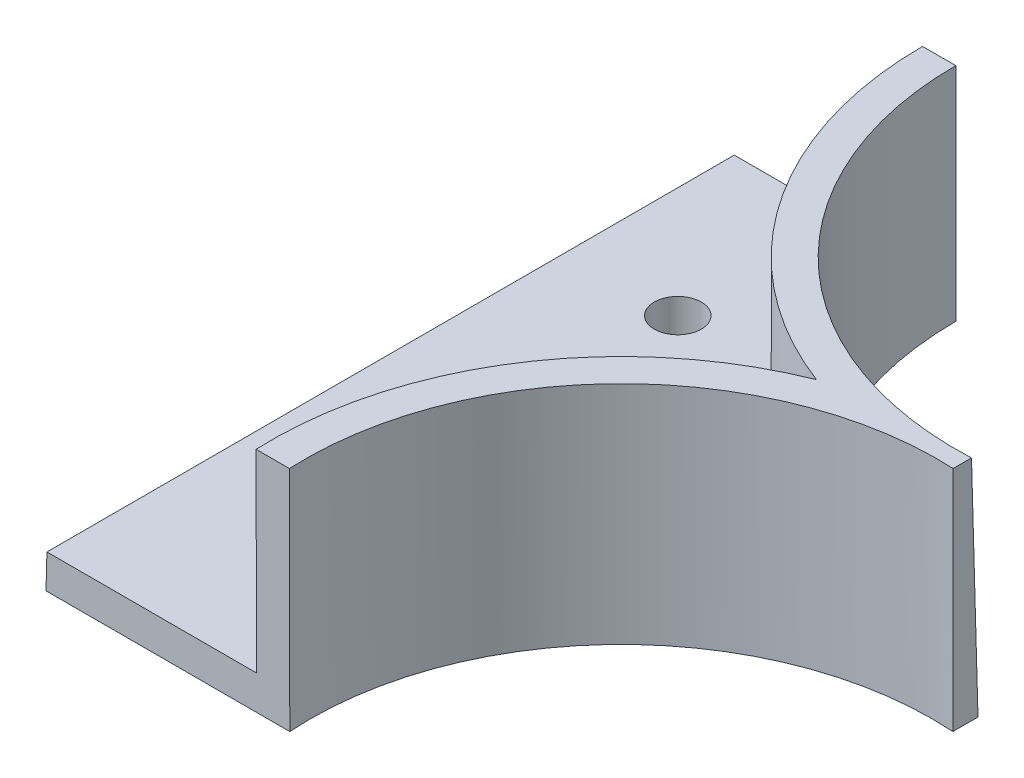
ISO-10303-21;
HEADER;
FILE_DESCRIPTION(('STEP AP214'),'2;1');
FILE_NAME('part.step','',(''),(''),'','','');
FILE_SCHEMA(('AUTOMOTIVE_DESIGN { 1 0 10303 214 1 1 1 1 }'));
ENDSEC;
DATA;
#1=APPLICATION_CONTEXT('core data for automotive mechanical design processes');
#2=APPLICATION_PROTOCOL_DEFINITION('international standard','automotive_design',2000,#1);
#3=PRODUCT_CONTEXT('',#1,'mechanical');
#4=PRODUCT('Part','Part','',(#3));
#5=PRODUCT_RELATED_PRODUCT_CATEGORY('part','',(#4));
#6=PRODUCT_DEFINITION_FORMATION('','',#4);
#7=PRODUCT_DEFINITION_CONTEXT('part definition',#1,'design');
#8=PRODUCT_DEFINITION('design','',#6,#7);
#9=PRODUCT_DEFINITION_SHAPE('','',#8);
#10=(LENGTH_UNIT() NAMED_UNIT(*) SI_UNIT(.MILLI.,.METRE.));
#11=(NAMED_UNIT(*) PLANE_ANGLE_UNIT() SI_UNIT($,.RADIAN.));
#12=(NAMED_UNIT(*) SI_UNIT($,.STERADIAN.) SOLID_ANGLE_UNIT());
#13=UNCERTAINTY_MEASURE_WITH_UNIT(LENGTH_MEASURE(1.E-05),#10,'distance_accuracy_value','');
#14=(GEOMETRIC_REPRESENTATION_CONTEXT(3) GLOBAL_UNCERTAINTY_ASSIGNED_CONTEXT((#13)) GLOBAL_UNIT_ASSIGNED_CONTEXT((#10,
#11,#12)) REPRESENTATION_CONTEXT('',''));
#15=CARTESIAN_POINT('',(0.,0.,0.));
#16=DIRECTION('',(0.,0.,1.));
#17=DIRECTION('',(1.,0.,0.));
#18=AXIS2_PLACEMENT_3D('',#15,#16,#17);
#19=CARTESIAN_POINT('',(0.,70.,30.1));
#20=DIRECTION('',(0.,0.027764619990052,0.999614488628895));
#21=DIRECTION('',(0.,-0.999614488628896,0.027764619990052));
#22=AXIS2_PLACEMENT_3D('',#19,#20,#21);
#23=PLANE('',#22);
#24=CARTESIAN_POINT('',(20.5510677321987,-51.0082949242049,33.4610450452984));
#25=CARTESIAN_POINT('',(20.2350674800329,-40.8551927948117,33.1790393065367));
#26=CARTESIAN_POINT('',(19.9241048759291,-30.7019348014339,32.8970292386016));
#27=CARTESIAN_POINT('',(19.3114474008707,-10.39514644559,32.3330015375908));
#28=CARTESIAN_POINT('',(19.0097525233991,-0.241616083320481,32.0509839045206));
#29=CARTESIAN_POINT('',(18.4148225292552,20.0656908120619,31.4869418009042));
#30=CARTESIAN_POINT('',(18.1215874116505,30.2194673451475,31.2049173303588));
#31=CARTESIAN_POINT('',(17.5429250394866,50.5272499485599,30.640862013796));
#32=CARTESIAN_POINT('',(17.2574977904158,60.681256019043,30.3588311677742));
#33=CARTESIAN_POINT('',(16.9756487494961,70.835360844513,30.0767975788003));
#34=B_SPLINE_CURVE_WITH_KNOTS('',3,(#24,#25,#26,#27,#28,#29,#30,#31,#32,#33),.UNSPECIFIED.,.F.,
.F.,(4,2,2,2,4),(0.,30.4857942211204,60.9715670039907,91.4573364265168,121.943127278152),.UNSPECIFIED.);
#35=CARTESIAN_POINT('',(18.9154450441281,3.,31.9609469555459));
#36=VERTEX_POINT('',#35);
#37=CARTESIAN_POINT('',(18.418129138932,20.,31.4887663847357));
#38=VERTEX_POINT('',#37);
#39=EDGE_CURVE('E213',#36,#38,#34,.T.);
#40=ORIENTED_EDGE('',*,*,#39,.F.);
#41=DIRECTION('',(-1.,0.,0.));
#42=VECTOR('',#41,1.);
#43=CARTESIAN_POINT('',(0.,3.,31.9609469555459));
#44=LINE('',#43,#42);
#45=CARTESIAN_POINT('',(0.,3.,31.9609469555459));
#46=VERTEX_POINT('',#45);
#47=EDGE_CURVE('E215',#36,#46,#44,.T.);
#48=ORIENTED_EDGE('',*,*,#47,.T.);
#49=DIRECTION('',(0.,-0.999614488628896,0.027764619990052));
#50=VECTOR('',#49,1.);
#51=CARTESIAN_POINT('',(0.,71.6707857680826,30.0535933777838));
#52=LINE('',#51,#50);
#53=CARTESIAN_POINT('',(0.,0.,32.04427293863));
#54=VERTEX_POINT('',#53);
#55=EDGE_CURVE('E156',#46,#54,#52,.T.);
#56=ORIENTED_EDGE('',*,*,#55,.T.);
#57=DIRECTION('',(-1.,0.,0.));
#58=VECTOR('',#57,1.);
#59=CARTESIAN_POINT('',(0.,0.,32.04427293863));
#60=LINE('',#59,#58);
#61=CARTESIAN_POINT('',(22.011723459952,0.,32.04427293863));
#62=VERTEX_POINT('',#61);
#63=EDGE_CURVE('E267',#62,#54,#60,.T.);
#64=ORIENTED_EDGE('',*,*,#63,.F.);
#65=CARTESIAN_POINT('',(22.011723459952,0.,32.04427293863));
#66=CARTESIAN_POINT('',(21.7410608127319,9.09174431583642,31.7917467609411));
#67=CARTESIAN_POINT('',(21.4742923334893,18.1836041859997,31.5392173736929));
#68=CARTESIAN_POINT('',(20.9479726645709,36.367529354211,31.0341528933697));
#69=CARTESIAN_POINT('',(20.6884214722099,45.4595946521814,30.7816178002968));
#70=CARTESIAN_POINT('',(20.3596352985134,57.1264461519254,30.4575671767258));
#71=CARTESIAN_POINT('',(20.2873437669017,59.7011465756542,30.386054028741));
#72=CARTESIAN_POINT('',(20.1432829093874,64.8505622927659,30.2430273197619));
#73=CARTESIAN_POINT('',(20.0715135835397,67.4252775861504,30.1715137587676));
#74=CARTESIAN_POINT('',(20.,70.,30.1));
#75=B_SPLINE_CURVE_WITH_KNOTS('',3,(#65,#66,#67,#68,#69,#70,#71,#72,#73,#74),.UNSPECIFIED.,.F.,
.F.,(4,2,2,2,4),(0.,27.2978299543117,54.5956497523319,62.3257727637899,70.0558965889786),.UNSPECIFIED.);
#76=CARTESIAN_POINT('',(21.4224910652476,20.,31.4887663847357));
#77=VERTEX_POINT('',#76);
#78=EDGE_CURVE('E180',#62,#77,#75,.T.);
#79=ORIENTED_EDGE('',*,*,#78,.T.);
#80=DIRECTION('',(-1.,0.,0.));
#81=VECTOR('',#80,1.);
#82=CARTESIAN_POINT('',(51.94427293863,20.,31.4887663847357));
#83=LINE('',#82,#81);
#84=EDGE_CURVE('E61',#77,#38,#83,.T.);
#85=ORIENTED_EDGE('',*,*,#84,.T.);
#86=EDGE_LOOP('',(#40,#48,#56,#64,#79,#85));
#87=FACE_BOUND('',#86,.T.);
#88=ADVANCED_FACE('F39',(#87),#23,.T.);
#89=CARTESIAN_POINT('',(0.,70.,-30.1));
#90=DIRECTION('',(1.,0.,0.));
#91=DIRECTION('',(0.,0.,-1.));
#92=AXIS2_PLACEMENT_3D('',#89,#90,#91);
#93=PLANE('',#92);
#94=DIRECTION('',(0.,0.,1.));
#95=VECTOR('',#94,1.);
#96=CARTESIAN_POINT('',(0.,3.,-30.1));
#97=LINE('',#96,#95);
#98=CARTESIAN_POINT('',(0.,3.,-30.1));
#99=VERTEX_POINT('',#98);
#100=EDGE_CURVE('E131',#99,#46,#97,.T.);
#101=ORIENTED_EDGE('',*,*,#100,.F.);
#102=DIRECTION('',(0.,-1.,0.));
#103=VECTOR('',#102,1.);
#104=CARTESIAN_POINT('',(0.,70.,-30.1));
#105=LINE('',#104,#103);
#106=CARTESIAN_POINT('',(0.,0.,-30.1));
#107=VERTEX_POINT('',#106);
#108=EDGE_CURVE('E48',#99,#107,#105,.T.);
#109=ORIENTED_EDGE('',*,*,#108,.T.);
#110=DIRECTION('',(0.,0.,1.));
#111=VECTOR('',#110,1.);
#112=CARTESIAN_POINT('',(0.,0.,-30.1));
#113=LINE('',#112,#111);
#114=EDGE_CURVE('E160',#107,#54,#113,.T.);
#115=ORIENTED_EDGE('',*,*,#114,.T.);
#116=ORIENTED_EDGE('',*,*,#55,.F.);
#117=EDGE_LOOP('',(#101,#109,#115,#116));
#118=FACE_BOUND('',#117,.T.);
#119=ADVANCED_FACE('F205',(#118),#93,.F.);
#120=CARTESIAN_POINT('',(50.,70.,-30.1));
#121=DIRECTION('',(0.999614488628895,0.027764619990052,0.));
#122=DIRECTION('',(-0.027764619990052,0.999614488628896,0.));
#123=AXIS2_PLACEMENT_3D('',#120,#121,#122);
#124=PLANE('',#123);
#125=CARTESIAN_POINT('',(50.,70.,-30.1));
#126=DIRECTION('',(0.999614488628895,0.027764619990052,0.));
#127=DIRECTION('',(-0.027764619990052,0.999614488628896,0.));
#128=AXIS2_PLACEMENT_3D('',#125,#126,#127);
#129=ELLIPSE('',#128,1080.51181722454,30.);
#130=CARTESIAN_POINT('',(51.94427293863,0.,-0.163069583871647));
#131=VERTEX_POINT('',#130);
#132=CARTESIAN_POINT('',(51.3887663847357,20.,-0.132161774184854));
#133=VERTEX_POINT('',#132);
#134=EDGE_CURVE('E159',#131,#133,#129,.F.);
#135=ORIENTED_EDGE('',*,*,#134,.T.);
#136=DIRECTION('',(0.,0.,-1.));
#137=VECTOR('',#136,1.);
#138=CARTESIAN_POINT('',(51.3887663847357,20.,-30.1));
#139=LINE('',#138,#137);
#140=CARTESIAN_POINT('',(51.3887663847357,20.,1.52249106524754));
#141=VERTEX_POINT('',#140);
#142=EDGE_CURVE('E141',#133,#141,#139,.F.);
#143=ORIENTED_EDGE('',*,*,#142,.T.);
#144=CARTESIAN_POINT('',(51.94427293863,0.,2.11172345995204));
#145=CARTESIAN_POINT('',(51.6917467609411,9.09174431583642,1.84106081273193));
#146=CARTESIAN_POINT('',(51.4392173736929,18.1836041859997,1.57429233348931));
#147=CARTESIAN_POINT('',(50.9341528933697,36.367529354211,1.04797266457088));
#148=CARTESIAN_POINT('',(50.6816178002968,45.4595946521814,0.788421472209872));
#149=CARTESIAN_POINT('',(50.3575671767258,57.1264461519254,0.459635298513346));
#150=CARTESIAN_POINT('',(50.286054028741,59.7011465756542,0.387343766901686));
#151=CARTESIAN_POINT('',(50.143027319762,64.8505622927659,0.243282909387387));
#152=CARTESIAN_POINT('',(50.0715137587676,67.4252775861504,0.171513583539721));
#153=CARTESIAN_POINT('',(50.,70.,0.100000000000001));
#154=B_SPLINE_CURVE_WITH_KNOTS('',3,(#144,#145,#146,#147,#148,#149,#150,#151,#152,#153),
.UNSPECIFIED.,.F.,.F.,(4,2,2,2,4),(0.,27.2978299543117,54.5956497523319,62.3257727637899,
70.0558965889786),.UNSPECIFIED.);
#155=CARTESIAN_POINT('',(51.94427293863,0.,2.11172345995204));
#156=VERTEX_POINT('',#155);
#157=EDGE_CURVE('E171',#156,#141,#154,.T.);
#158=ORIENTED_EDGE('',*,*,#157,.F.);
#159=DIRECTION('',(0.,0.,1.));
#160=VECTOR('',#159,1.);
#161=CARTESIAN_POINT('',(51.94427293863,0.,-30.1));
#162=LINE('',#161,#160);
#163=EDGE_CURVE('E164',#156,#131,#162,.F.);
#164=ORIENTED_EDGE('',*,*,#163,.T.);
#165=EDGE_LOOP('',(#135,#143,#158,#164));
#166=FACE_BOUND('',#165,.T.);
#167=ADVANCED_FACE('F186',(#166),#124,.T.);
#168=CARTESIAN_POINT('',(0.,70.,-30.1));
#169=DIRECTION('',(0.,0.,1.));
#170=DIRECTION('',(1.,0.,0.));
#171=AXIS2_PLACEMENT_3D('',#168,#169,#170);
#172=PLANE('',#171);
#173=DIRECTION('',(-1.,0.,0.));
#174=VECTOR('',#173,1.);
#175=CARTESIAN_POINT('',(0.,3.,-30.1));
#176=LINE('',#175,#174);
#177=CARTESIAN_POINT('',(17.,3.,-30.1));
#178=VERTEX_POINT('',#177);
#179=EDGE_CURVE('E129',#178,#99,#176,.T.);
#180=ORIENTED_EDGE('',*,*,#179,.F.);
#181=DIRECTION('',(0.,1.,0.));
#182=VECTOR('',#181,1.);
#183=CARTESIAN_POINT('',(17.,3.,-30.1));
#184=LINE('',#183,#182);
#185=CARTESIAN_POINT('',(17.,20.,-30.1));
#186=VERTEX_POINT('',#185);
#187=EDGE_CURVE('E114',#178,#186,#184,.T.);
#188=ORIENTED_EDGE('',*,*,#187,.T.);
#189=DIRECTION('',(-1.,0.,0.));
#190=VECTOR('',#189,1.);
#191=CARTESIAN_POINT('',(51.94427293863,20.,-30.1));
#192=LINE('',#191,#190);
#193=CARTESIAN_POINT('',(20.,20.,-30.1));
#194=VERTEX_POINT('',#193);
#195=EDGE_CURVE('E126',#194,#186,#192,.T.);
#196=ORIENTED_EDGE('',*,*,#195,.F.);
#197=DIRECTION('',(0.,1.,0.));
#198=VECTOR('',#197,1.);
#199=CARTESIAN_POINT('',(20.,0.,-30.1));
#200=LINE('',#199,#198);
#201=CARTESIAN_POINT('',(20.,0.,-30.1));
#202=VERTEX_POINT('',#201);
#203=EDGE_CURVE('E155',#202,#194,#200,.T.);
#204=ORIENTED_EDGE('',*,*,#203,.F.);
#205=DIRECTION('',(-1.,0.,0.));
#206=VECTOR('',#205,1.);
#207=CARTESIAN_POINT('',(0.,0.,-30.1));
#208=LINE('',#207,#206);
#209=EDGE_CURVE('E165',#202,#107,#208,.T.);
#210=ORIENTED_EDGE('',*,*,#209,.T.);
#211=ORIENTED_EDGE('',*,*,#108,.F.);
#212=EDGE_LOOP('',(#180,#188,#196,#204,#210,#211));
#213=FACE_BOUND('',#212,.T.);
#214=ADVANCED_FACE('F124',(#213),#172,.F.);
#215=CARTESIAN_POINT('',(0.,0.,0.));
#216=DIRECTION('',(0.,1.,0.));
#217=DIRECTION('',(0.,0.,1.));
#218=AXIS2_PLACEMENT_3D('',#215,#216,#217);
#219=PLANE('',#218);
#220=CARTESIAN_POINT('',(10.,0.,-15.));
#221=DIRECTION('',(0.,1.,0.));
#222=DIRECTION('',(0.,0.,1.));
#223=AXIS2_PLACEMENT_3D('',#220,#221,#222);
#224=CIRCLE('',#223,2.125);
#225=CARTESIAN_POINT('',(10.,0.,-12.875));
#226=VERTEX_POINT('',#225);
#227=EDGE_CURVE('E120',#226,#226,#224,.T.);
#228=ORIENTED_EDGE('',*,*,#227,.T.);
#229=EDGE_LOOP('',(#228));
#230=FACE_BOUND('',#229,.T.);
#231=CARTESIAN_POINT('',(10.,0.,15.));
#232=DIRECTION('',(0.,1.,0.));
#233=DIRECTION('',(0.,0.,-1.));
#234=AXIS2_PLACEMENT_3D('',#231,#232,#233);
#235=CIRCLE('',#234,2.125);
#236=CARTESIAN_POINT('',(10.,0.,12.875));
#237=VERTEX_POINT('',#236);
#238=EDGE_CURVE('E290',#237,#237,#235,.T.);
#239=ORIENTED_EDGE('',*,*,#238,.T.);
#240=EDGE_LOOP('',(#239));
#241=FACE_BOUND('',#240,.T.);
#242=CARTESIAN_POINT('',(50.,0.,30.1));
#243=DIRECTION('',(0.,1.,0.));
#244=DIRECTION('',(0.,0.,1.));
#245=AXIS2_PLACEMENT_3D('',#242,#243,#244);
#246=CIRCLE('',#245,28.05572706137);
#247=EDGE_CURVE('E150',#62,#156,#246,.F.);
#248=ORIENTED_EDGE('',*,*,#247,.F.);
#249=ORIENTED_EDGE('',*,*,#63,.T.);
#250=ORIENTED_EDGE('',*,*,#114,.F.);
#251=ORIENTED_EDGE('',*,*,#209,.F.);
#252=CARTESIAN_POINT('',(50.,0.,-30.1));
#253=DIRECTION('',(0.,1.,0.));
#254=DIRECTION('',(0.,0.,-1.));
#255=AXIS2_PLACEMENT_3D('',#252,#253,#254);
#256=CIRCLE('',#255,30.);
#257=EDGE_CURVE('E151',#202,#131,#256,.T.);
#258=ORIENTED_EDGE('',*,*,#257,.T.);
#259=ORIENTED_EDGE('',*,*,#163,.F.);
#260=EDGE_LOOP('',(#248,#249,#250,#251,#258,#259));
#261=FACE_BOUND('',#260,.T.);
#262=ADVANCED_FACE('F201',(#230,#241,#261),#219,.F.);
#263=CARTESIAN_POINT('',(50.,0.,-30.1));
#264=DIRECTION('',(0.,1.,0.));
#265=DIRECTION('',(0.,0.,1.));
#266=AXIS2_PLACEMENT_3D('',#263,#264,#265);
#267=CYLINDRICAL_SURFACE('',#266,30.);
#268=ORIENTED_EDGE('',*,*,#203,.T.);
#269=CARTESIAN_POINT('',(50.,20.,-30.1));
#270=DIRECTION('',(0.,-1.,0.));
#271=DIRECTION('',(0.,0.,-1.));
#272=AXIS2_PLACEMENT_3D('',#269,#270,#271);
#273=CIRCLE('',#272,30.);
#274=EDGE_CURVE('E136',#194,#133,#273,.F.);
#275=ORIENTED_EDGE('',*,*,#274,.T.);
#276=ORIENTED_EDGE('',*,*,#134,.F.);
#277=ORIENTED_EDGE('',*,*,#257,.F.);
#278=EDGE_LOOP('',(#268,#275,#276,#277));
#279=FACE_BOUND('',#278,.T.);
#280=ADVANCED_FACE('F192',(#279),#267,.F.);
#281=CARTESIAN_POINT('',(50.,70.,30.1));
#282=DIRECTION('',(0.,1.,0.));
#283=DIRECTION('',(0.,0.,1.));
#284=AXIS2_PLACEMENT_3D('',#281,#282,#283);
#285=CONICAL_SURFACE('',#284,30.,0.0277681883992298);
#286=CARTESIAN_POINT('',(50.,20.,30.1));
#287=DIRECTION('',(0.,-1.,0.));
#288=DIRECTION('',(0.,0.,-1.));
#289=AXIS2_PLACEMENT_3D('',#286,#287,#288);
#290=CIRCLE('',#289,28.6112336152643);
#291=EDGE_CURVE('E11',#77,#141,#290,.T.);
#292=ORIENTED_EDGE('',*,*,#291,.F.);
#293=ORIENTED_EDGE('',*,*,#78,.F.);
#294=ORIENTED_EDGE('',*,*,#247,.T.);
#295=ORIENTED_EDGE('',*,*,#157,.T.);
#296=EDGE_LOOP('',(#292,#293,#294,#295));
#297=FACE_BOUND('',#296,.T.);
#298=ADVANCED_FACE('F189',(#297),#285,.F.);
#299=CARTESIAN_POINT('',(51.94427293863,20.,-30.1));
#300=DIRECTION('',(0.,-1.,0.));
#301=DIRECTION('',(0.,0.,-1.));
#302=AXIS2_PLACEMENT_3D('',#299,#300,#301);
#303=PLANE('',#302);
#304=CARTESIAN_POINT('',(50.,20.,30.1));
#305=DIRECTION('',(0.,-1.,0.));
#306=DIRECTION('',(0.,0.,-1.));
#307=AXIS2_PLACEMENT_3D('',#304,#305,#306);
#308=CIRCLE('',#307,31.6123905954066);
#309=CARTESIAN_POINT('',(38.2693945248915,20.,0.744657482088448));
#310=VERTEX_POINT('',#309);
#311=EDGE_CURVE('E55',#38,#310,#308,.T.);
#312=ORIENTED_EDGE('',*,*,#311,.F.);
#313=ORIENTED_EDGE('',*,*,#84,.F.);
#314=ORIENTED_EDGE('',*,*,#291,.T.);
#315=ORIENTED_EDGE('',*,*,#142,.F.);
#316=ORIENTED_EDGE('',*,*,#274,.F.);
#317=ORIENTED_EDGE('',*,*,#195,.T.);
#318=CARTESIAN_POINT('',(50.,20.,-30.1));
#319=DIRECTION('',(0.,-1.,0.));
#320=DIRECTION('',(0.,0.,-1.));
#321=AXIS2_PLACEMENT_3D('',#318,#319,#320);
#322=CIRCLE('',#321,33.);
#323=EDGE_CURVE('E110',#186,#310,#322,.F.);
#324=ORIENTED_EDGE('',*,*,#323,.T.);
#325=EDGE_LOOP('',(#312,#313,#314,#315,#316,#317,#324));
#326=FACE_BOUND('',#325,.T.);
#327=ADVANCED_FACE('F134',(#326),#303,.F.);
#328=CARTESIAN_POINT('',(0.,3.,0.));
#329=DIRECTION('',(0.,1.,0.));
#330=DIRECTION('',(0.,0.,1.));
#331=AXIS2_PLACEMENT_3D('',#328,#329,#330);
#332=PLANE('',#331);
#333=CARTESIAN_POINT('',(10.,3.,-15.));
#334=DIRECTION('',(0.,1.,0.));
#335=DIRECTION('',(0.,0.,1.));
#336=AXIS2_PLACEMENT_3D('',#333,#334,#335);
#337=CIRCLE('',#336,2.125);
#338=CARTESIAN_POINT('',(10.,3.,-12.875));
#339=VERTEX_POINT('',#338);
#340=EDGE_CURVE('E294',#339,#339,#337,.T.);
#341=ORIENTED_EDGE('',*,*,#340,.F.);
#342=EDGE_LOOP('',(#341));
#343=FACE_BOUND('',#342,.T.);
#344=CARTESIAN_POINT('',(10.,3.,15.));
#345=DIRECTION('',(0.,1.,0.));
#346=DIRECTION('',(0.,0.,-1.));
#347=AXIS2_PLACEMENT_3D('',#344,#345,#346);
#348=CIRCLE('',#347,2.125);
#349=CARTESIAN_POINT('',(10.,3.,12.875));
#350=VERTEX_POINT('',#349);
#351=EDGE_CURVE('E286',#350,#350,#348,.T.);
#352=ORIENTED_EDGE('',*,*,#351,.F.);
#353=EDGE_LOOP('',(#352));
#354=FACE_BOUND('',#353,.T.);
#355=CARTESIAN_POINT('',(50.,3.,-30.1));
#356=DIRECTION('',(0.,1.,0.));
#357=DIRECTION('',(0.,0.,1.));
#358=AXIS2_PLACEMENT_3D('',#355,#356,#357);
#359=CIRCLE('',#358,33.);
#360=CARTESIAN_POINT('',(38.9381403984316,3.,0.990758468638067));
#361=VERTEX_POINT('',#360);
#362=EDGE_CURVE('E132',#178,#361,#359,.T.);
#363=ORIENTED_EDGE('',*,*,#362,.F.);
#364=ORIENTED_EDGE('',*,*,#179,.T.);
#365=ORIENTED_EDGE('',*,*,#100,.T.);
#366=ORIENTED_EDGE('',*,*,#47,.F.);
#367=CARTESIAN_POINT('',(50.,3.,30.1));
#368=DIRECTION('',(0.,1.,0.));
#369=DIRECTION('',(0.,0.,1.));
#370=AXIS2_PLACEMENT_3D('',#367,#368,#369);
#371=CIRCLE('',#370,31.1402100245964);
#372=EDGE_CURVE('E119',#36,#361,#371,.F.);
#373=ORIENTED_EDGE('',*,*,#372,.T.);
#374=EDGE_LOOP('',(#363,#364,#365,#366,#373));
#375=FACE_BOUND('',#374,.T.);
#376=ADVANCED_FACE('F199',(#343,#354,#375),#332,.T.);
#377=CARTESIAN_POINT('',(50.,0.,-30.1));
#378=DIRECTION('',(0.,1.,0.));
#379=DIRECTION('',(0.,0.,1.));
#380=AXIS2_PLACEMENT_3D('',#377,#378,#379);
#381=CYLINDRICAL_SURFACE('',#380,33.);
#382=CARTESIAN_POINT('',(39.693187155675,-15.1313803197906,1.24915643190508));
#383=CARTESIAN_POINT('',(39.5673399912795,-12.2040470722476,1.20777786082633));
#384=CARTESIAN_POINT('',(39.4435223467327,-9.27662961641002,1.16623337257719));
#385=CARTESIAN_POINT('',(39.1995904043615,-3.42164597587302,1.08281279347327));
#386=CARTESIAN_POINT('',(39.0794761053862,-0.494079791220062,1.04093670272156));
#387=CARTESIAN_POINT('',(38.7241555076513,8.28879193637937,0.914811667554612));
#388=CARTESIAN_POINT('',(38.4939705199803,14.1442937682075,0.830065633488734));
#389=CARTESIAN_POINT('',(38.0448187912101,25.8556994157271,0.659249430103592));
#390=CARTESIAN_POINT('',(37.825852037053,31.7116032309427,0.573179262325742));
#391=CARTESIAN_POINT('',(37.3976069922469,43.4237687715657,0.39971520510839));
#392=CARTESIAN_POINT('',(37.1883287393344,49.2800304982782,0.312321310514761));
#393=CARTESIAN_POINT('',(36.9831308331422,55.1364229292236,0.224266142693484));
#394=B_SPLINE_CURVE_WITH_KNOTS('',3,(#382,#383,#384,#385,#386,#387,#388,#389,#390,#391,#392,
#393),.UNSPECIFIED.,.F.,.F.,(4,2,2,2,2,4),(0.,8.79098598896893,17.5819692459342,
35.1638663440735,52.7457429768142,70.3276880847998),.UNSPECIFIED.);
#395=EDGE_CURVE('E116',#361,#310,#394,.T.);
#396=ORIENTED_EDGE('',*,*,#395,.T.);
#397=ORIENTED_EDGE('',*,*,#323,.F.);
#398=ORIENTED_EDGE('',*,*,#187,.F.);
#399=ORIENTED_EDGE('',*,*,#362,.T.);
#400=EDGE_LOOP('',(#396,#397,#398,#399));
#401=FACE_BOUND('',#400,.T.);
#402=ADVANCED_FACE('F112',(#401),#381,.T.);
#403=CARTESIAN_POINT('',(50.,69.9167061400298,30.1));
#404=DIRECTION('',(0.,1.,0.));
#405=DIRECTION('',(0.,0.,1.));
#406=AXIS2_PLACEMENT_3D('',#403,#404,#405);
#407=CONICAL_SURFACE('',#406,32.9988434658867,0.0277681883992298);
#408=ORIENTED_EDGE('',*,*,#372,.F.);
#409=ORIENTED_EDGE('',*,*,#39,.T.);
#410=ORIENTED_EDGE('',*,*,#311,.T.);
#411=ORIENTED_EDGE('',*,*,#395,.F.);
#412=EDGE_LOOP('',(#408,#409,#410,#411));
#413=FACE_BOUND('',#412,.T.);
#414=ADVANCED_FACE('F235',(#413),#407,.T.);
#415=CARTESIAN_POINT('',(10.,0.,15.));
#416=DIRECTION('',(0.,1.,0.));
#417=DIRECTION('',(0.,0.,1.));
#418=AXIS2_PLACEMENT_3D('',#415,#416,#417);
#419=CYLINDRICAL_SURFACE('',#418,2.125);
#420=ORIENTED_EDGE('',*,*,#238,.F.);
#421=EDGE_LOOP('',(#420));
#422=FACE_BOUND('',#421,.T.);
#423=ORIENTED_EDGE('',*,*,#351,.T.);
#424=EDGE_LOOP('',(#423));
#425=FACE_BOUND('',#424,.T.);
#426=ADVANCED_FACE('F239',(#422,#425),#419,.F.);
#427=CARTESIAN_POINT('',(10.,0.,-15.));
#428=DIRECTION('',(0.,1.,0.));
#429=DIRECTION('',(0.,0.,1.));
#430=AXIS2_PLACEMENT_3D('',#427,#428,#429);
#431=CYLINDRICAL_SURFACE('',#430,2.125);
#432=ORIENTED_EDGE('',*,*,#227,.F.);
#433=EDGE_LOOP('',(#432));
#434=FACE_BOUND('',#433,.T.);
#435=ORIENTED_EDGE('',*,*,#340,.T.);
#436=EDGE_LOOP('',(#435));
#437=FACE_BOUND('',#436,.T.);
#438=ADVANCED_FACE('F303',(#434,#437),#431,.F.);
#439=CLOSED_SHELL('',(#88,#119,#167,#214,#262,#280,#298,#327,#376,#402,#414,#426,#438));
#440=MANIFOLD_SOLID_BREP('B2',#439);
#441=ADVANCED_BREP_SHAPE_REPRESENTATION('',(#18,#440),#14);
#442=SHAPE_DEFINITION_REPRESENTATION(#9,#441);
ENDSEC;
END-ISO-10303-21;
